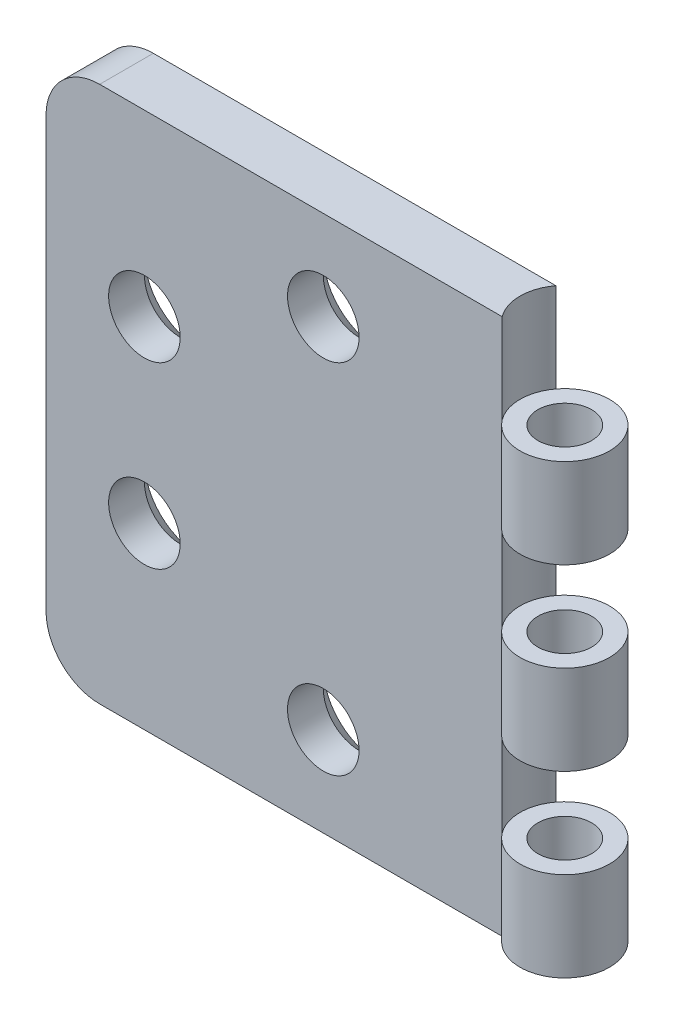
ISO-10303-21;
HEADER;
FILE_DESCRIPTION(('STEP AP214'),'2;1');
FILE_NAME('part.step','',(''),(''),'','','');
FILE_SCHEMA(('AUTOMOTIVE_DESIGN { 1 0 10303 214 1 1 1 1 }'));
ENDSEC;
DATA;
#1=APPLICATION_CONTEXT('core data for automotive mechanical design processes');
#2=APPLICATION_PROTOCOL_DEFINITION('international standard','automotive_design',2000,#1);
#3=PRODUCT_CONTEXT('',#1,'mechanical');
#4=PRODUCT('Part','Part','',(#3));
#5=PRODUCT_RELATED_PRODUCT_CATEGORY('part','',(#4));
#6=PRODUCT_DEFINITION_FORMATION('','',#4);
#7=PRODUCT_DEFINITION_CONTEXT('part definition',#1,'design');
#8=PRODUCT_DEFINITION('design','',#6,#7);
#9=PRODUCT_DEFINITION_SHAPE('','',#8);
#10=(LENGTH_UNIT() NAMED_UNIT(*) SI_UNIT(.MILLI.,.METRE.));
#11=(NAMED_UNIT(*) PLANE_ANGLE_UNIT() SI_UNIT($,.RADIAN.));
#12=(NAMED_UNIT(*) SI_UNIT($,.STERADIAN.) SOLID_ANGLE_UNIT());
#13=UNCERTAINTY_MEASURE_WITH_UNIT(LENGTH_MEASURE(1.E-05),#10,'distance_accuracy_value','');
#14=(GEOMETRIC_REPRESENTATION_CONTEXT(3) GLOBAL_UNCERTAINTY_ASSIGNED_CONTEXT((#13)) GLOBAL_UNIT_ASSIGNED_CONTEXT((#10,
#11,#12)) REPRESENTATION_CONTEXT('',''));
#15=CARTESIAN_POINT('',(0.,0.,0.));
#16=DIRECTION('',(0.,0.,1.));
#17=DIRECTION('',(1.,0.,0.));
#18=AXIS2_PLACEMENT_3D('',#15,#16,#17);
#19=CARTESIAN_POINT('',(12.5,15.,1.5));
#20=DIRECTION('',(0.,-1.,0.));
#21=DIRECTION('',(0.,0.,-1.));
#22=AXIS2_PLACEMENT_3D('',#19,#20,#21);
#23=CYLINDRICAL_SURFACE('',#22,2.5);
#24=DIRECTION('',(0.,-1.,0.));
#25=VECTOR('',#24,1.);
#26=CARTESIAN_POINT('',(10.5,22.0710678118655,0.));
#27=LINE('',#26,#25);
#28=CARTESIAN_POINT('',(10.5,10.,0.));
#29=VERTEX_POINT('',#28);
#30=CARTESIAN_POINT('',(10.5,5.,0.));
#31=VERTEX_POINT('',#30);
#32=EDGE_CURVE('E142',#29,#31,#27,.T.);
#33=ORIENTED_EDGE('',*,*,#32,.F.);
#34=CARTESIAN_POINT('',(12.5,10.,1.5));
#35=DIRECTION('',(0.,1.,0.));
#36=DIRECTION('',(0.,0.,1.));
#37=AXIS2_PLACEMENT_3D('',#34,#35,#36);
#38=CIRCLE('',#37,2.5);
#39=CARTESIAN_POINT('',(10.5,10.,3.));
#40=VERTEX_POINT('',#39);
#41=EDGE_CURVE('E153',#40,#29,#38,.T.);
#42=ORIENTED_EDGE('',*,*,#41,.F.);
#43=DIRECTION('',(0.,-1.,0.));
#44=VECTOR('',#43,1.);
#45=CARTESIAN_POINT('',(10.5,22.0710678118655,3.));
#46=LINE('',#45,#44);
#47=CARTESIAN_POINT('',(10.5,5.,3.));
#48=VERTEX_POINT('',#47);
#49=EDGE_CURVE('E284',#40,#48,#46,.T.);
#50=ORIENTED_EDGE('',*,*,#49,.T.);
#51=CARTESIAN_POINT('',(12.5,5.,1.5));
#52=DIRECTION('',(0.,-1.,0.));
#53=DIRECTION('',(0.,0.,-1.));
#54=AXIS2_PLACEMENT_3D('',#51,#52,#53);
#55=CIRCLE('',#54,2.5);
#56=EDGE_CURVE('E304',#31,#48,#55,.T.);
#57=ORIENTED_EDGE('',*,*,#56,.F.);
#58=EDGE_LOOP('',(#33,#42,#50,#57));
#59=FACE_BOUND('',#58,.T.);
#60=ADVANCED_FACE('F52',(#59),#23,.T.);
#61=CARTESIAN_POINT('',(12.5,0.,1.5));
#62=DIRECTION('',(0.,-1.,0.));
#63=DIRECTION('',(0.,0.,-1.));
#64=AXIS2_PLACEMENT_3D('',#61,#62,#63);
#65=CIRCLE('',#64,2.5);
#66=CARTESIAN_POINT('',(10.5,0.,0.));
#67=VERTEX_POINT('',#66);
#68=CARTESIAN_POINT('',(10.5,0.,3.));
#69=VERTEX_POINT('',#68);
#70=EDGE_CURVE('E293',#67,#69,#65,.T.);
#71=ORIENTED_EDGE('',*,*,#70,.T.);
#72=CARTESIAN_POINT('',(10.5,-5.,3.));
#73=VERTEX_POINT('',#72);
#74=EDGE_CURVE('E280',#69,#73,#46,.T.);
#75=ORIENTED_EDGE('',*,*,#74,.T.);
#76=CARTESIAN_POINT('',(12.5,-5.,1.5));
#77=DIRECTION('',(0.,-1.,0.));
#78=DIRECTION('',(0.,0.,-1.));
#79=AXIS2_PLACEMENT_3D('',#76,#77,#78);
#80=CIRCLE('',#79,2.5);
#81=CARTESIAN_POINT('',(10.5,-5.,0.));
#82=VERTEX_POINT('',#81);
#83=EDGE_CURVE('E192',#73,#82,#80,.F.);
#84=ORIENTED_EDGE('',*,*,#83,.T.);
#85=EDGE_CURVE('E401',#67,#82,#27,.T.);
#86=ORIENTED_EDGE('',*,*,#85,.F.);
#87=EDGE_LOOP('',(#71,#75,#84,#86));
#88=FACE_BOUND('',#87,.T.);
#89=ADVANCED_FACE('F237',(#88),#23,.T.);
#90=CARTESIAN_POINT('',(-15.,15.,3.));
#91=DIRECTION('',(0.,-1.,0.));
#92=DIRECTION('',(0.,0.,-1.));
#93=AXIS2_PLACEMENT_3D('',#90,#91,#92);
#94=PLANE('',#93);
#95=DIRECTION('',(-1.,0.,0.));
#96=VECTOR('',#95,1.);
#97=CARTESIAN_POINT('',(-15.,15.,3.));
#98=LINE('',#97,#96);
#99=CARTESIAN_POINT('',(10.5,15.,3.));
#100=VERTEX_POINT('',#99);
#101=CARTESIAN_POINT('',(-12.,15.,3.));
#102=VERTEX_POINT('',#101);
#103=EDGE_CURVE('E151',#100,#102,#98,.T.);
#104=ORIENTED_EDGE('',*,*,#103,.F.);
#105=CARTESIAN_POINT('',(12.5,15.,1.5));
#106=DIRECTION('',(0.,1.,0.));
#107=DIRECTION('',(0.,0.,1.));
#108=AXIS2_PLACEMENT_3D('',#105,#106,#107);
#109=CIRCLE('',#108,2.5);
#110=CARTESIAN_POINT('',(10.5,15.,0.));
#111=VERTEX_POINT('',#110);
#112=EDGE_CURVE('E137',#111,#100,#109,.T.);
#113=ORIENTED_EDGE('',*,*,#112,.F.);
#114=DIRECTION('',(-1.,0.,0.));
#115=VECTOR('',#114,1.);
#116=CARTESIAN_POINT('',(-15.,15.,0.));
#117=LINE('',#116,#115);
#118=CARTESIAN_POINT('',(-12.,15.,0.));
#119=VERTEX_POINT('',#118);
#120=EDGE_CURVE('E148',#111,#119,#117,.T.);
#121=ORIENTED_EDGE('',*,*,#120,.T.);
#122=DIRECTION('',(0.,0.,-1.));
#123=VECTOR('',#122,1.);
#124=CARTESIAN_POINT('',(-12.,15.,3.));
#125=LINE('',#124,#123);
#126=EDGE_CURVE('E181',#119,#102,#125,.F.);
#127=ORIENTED_EDGE('',*,*,#126,.T.);
#128=EDGE_LOOP('',(#104,#113,#121,#127));
#129=FACE_BOUND('',#128,.T.);
#130=ADVANCED_FACE('F147',(#129),#94,.F.);
#131=CARTESIAN_POINT('',(-15.,-15.,3.));
#132=DIRECTION('',(0.,1.,0.));
#133=DIRECTION('',(0.,0.,1.));
#134=AXIS2_PLACEMENT_3D('',#131,#132,#133);
#135=PLANE('',#134);
#136=CARTESIAN_POINT('',(12.5,-15.,1.5));
#137=DIRECTION('',(0.,-1.,0.));
#138=DIRECTION('',(0.,0.,-1.));
#139=AXIS2_PLACEMENT_3D('',#136,#137,#138);
#140=CIRCLE('',#139,1.5);
#141=CARTESIAN_POINT('',(12.5,-15.,0.));
#142=VERTEX_POINT('',#141);
#143=EDGE_CURVE('E200',#142,#142,#140,.T.);
#144=ORIENTED_EDGE('',*,*,#143,.F.);
#145=EDGE_LOOP('',(#144));
#146=FACE_BOUND('',#145,.T.);
#147=DIRECTION('',(1.,0.,0.));
#148=VECTOR('',#147,1.);
#149=CARTESIAN_POINT('',(-15.,-15.,3.));
#150=LINE('',#149,#148);
#151=CARTESIAN_POINT('',(-12.,-15.,3.));
#152=VERTEX_POINT('',#151);
#153=CARTESIAN_POINT('',(10.5,-15.,3.));
#154=VERTEX_POINT('',#153);
#155=EDGE_CURVE('E169',#152,#154,#150,.T.);
#156=ORIENTED_EDGE('',*,*,#155,.F.);
#157=DIRECTION('',(0.,0.,-1.));
#158=VECTOR('',#157,1.);
#159=CARTESIAN_POINT('',(-12.,-15.,3.));
#160=LINE('',#159,#158);
#161=CARTESIAN_POINT('',(-12.,-15.,0.));
#162=VERTEX_POINT('',#161);
#163=EDGE_CURVE('E187',#152,#162,#160,.T.);
#164=ORIENTED_EDGE('',*,*,#163,.T.);
#165=DIRECTION('',(1.,0.,0.));
#166=VECTOR('',#165,1.);
#167=CARTESIAN_POINT('',(-15.,-15.,0.));
#168=LINE('',#167,#166);
#169=CARTESIAN_POINT('',(10.5,-15.,0.));
#170=VERTEX_POINT('',#169);
#171=EDGE_CURVE('E163',#162,#170,#168,.T.);
#172=ORIENTED_EDGE('',*,*,#171,.T.);
#173=CARTESIAN_POINT('',(12.5,-15.,1.5));
#174=DIRECTION('',(0.,-1.,0.));
#175=DIRECTION('',(0.,0.,-1.));
#176=AXIS2_PLACEMENT_3D('',#173,#174,#175);
#177=CIRCLE('',#176,2.5);
#178=EDGE_CURVE('E160',#170,#154,#177,.T.);
#179=ORIENTED_EDGE('',*,*,#178,.T.);
#180=EDGE_LOOP('',(#156,#164,#172,#179));
#181=FACE_BOUND('',#180,.T.);
#182=ADVANCED_FACE('F417',(#146,#181),#135,.F.);
#183=CARTESIAN_POINT('',(0.,0.,3.));
#184=DIRECTION('',(0.,0.,1.));
#185=DIRECTION('',(1.,0.,0.));
#186=AXIS2_PLACEMENT_3D('',#183,#184,#185);
#187=PLANE('',#186);
#188=CARTESIAN_POINT('',(0.499999999999997,10.,3.));
#189=DIRECTION('',(0.,0.,1.));
#190=DIRECTION('',(1.,0.,0.));
#191=AXIS2_PLACEMENT_3D('',#188,#189,#190);
#192=CIRCLE('',#191,2.);
#193=CARTESIAN_POINT('',(2.5,10.,3.));
#194=VERTEX_POINT('',#193);
#195=EDGE_CURVE('E309',#194,#194,#192,.T.);
#196=ORIENTED_EDGE('',*,*,#195,.F.);
#197=EDGE_LOOP('',(#196));
#198=FACE_BOUND('',#197,.T.);
#199=CARTESIAN_POINT('',(-9.50000000000001,5.,3.));
#200=DIRECTION('',(0.,0.,1.));
#201=DIRECTION('',(1.,0.,0.));
#202=AXIS2_PLACEMENT_3D('',#199,#200,#201);
#203=CIRCLE('',#202,2.);
#204=CARTESIAN_POINT('',(-7.50000000000001,5.,3.));
#205=VERTEX_POINT('',#204);
#206=EDGE_CURVE('E313',#205,#205,#203,.T.);
#207=ORIENTED_EDGE('',*,*,#206,.F.);
#208=EDGE_LOOP('',(#207));
#209=FACE_BOUND('',#208,.T.);
#210=CARTESIAN_POINT('',(0.5,-10.,3.));
#211=DIRECTION('',(0.,0.,1.));
#212=DIRECTION('',(1.,0.,0.));
#213=AXIS2_PLACEMENT_3D('',#210,#211,#212);
#214=CIRCLE('',#213,2.);
#215=CARTESIAN_POINT('',(2.5,-10.,3.));
#216=VERTEX_POINT('',#215);
#217=EDGE_CURVE('E282',#216,#216,#214,.F.);
#218=ORIENTED_EDGE('',*,*,#217,.T.);
#219=EDGE_LOOP('',(#218));
#220=FACE_BOUND('',#219,.T.);
#221=CARTESIAN_POINT('',(-9.5,-5.,3.));
#222=DIRECTION('',(0.,0.,1.));
#223=DIRECTION('',(1.,0.,0.));
#224=AXIS2_PLACEMENT_3D('',#221,#222,#223);
#225=CIRCLE('',#224,2.);
#226=CARTESIAN_POINT('',(-7.5,-5.,3.));
#227=VERTEX_POINT('',#226);
#228=EDGE_CURVE('E278',#227,#227,#225,.F.);
#229=ORIENTED_EDGE('',*,*,#228,.T.);
#230=EDGE_LOOP('',(#229));
#231=FACE_BOUND('',#230,.T.);
#232=ORIENTED_EDGE('',*,*,#103,.T.);
#233=CARTESIAN_POINT('',(-12.,12.,3.));
#234=DIRECTION('',(0.,0.,1.));
#235=DIRECTION('',(1.,0.,0.));
#236=AXIS2_PLACEMENT_3D('',#233,#234,#235);
#237=CIRCLE('',#236,3.);
#238=CARTESIAN_POINT('',(-15.,12.,3.));
#239=VERTEX_POINT('',#238);
#240=EDGE_CURVE('E185',#102,#239,#237,.T.);
#241=ORIENTED_EDGE('',*,*,#240,.T.);
#242=DIRECTION('',(0.,-1.,0.));
#243=VECTOR('',#242,1.);
#244=CARTESIAN_POINT('',(-15.,15.,3.));
#245=LINE('',#244,#243);
#246=CARTESIAN_POINT('',(-15.,-12.,3.));
#247=VERTEX_POINT('',#246);
#248=EDGE_CURVE('E406',#239,#247,#245,.T.);
#249=ORIENTED_EDGE('',*,*,#248,.T.);
#250=CARTESIAN_POINT('',(-12.,-12.,3.));
#251=DIRECTION('',(0.,0.,1.));
#252=DIRECTION('',(1.,0.,0.));
#253=AXIS2_PLACEMENT_3D('',#250,#251,#252);
#254=CIRCLE('',#253,3.);
#255=EDGE_CURVE('E183',#247,#152,#254,.T.);
#256=ORIENTED_EDGE('',*,*,#255,.T.);
#257=ORIENTED_EDGE('',*,*,#155,.T.);
#258=CARTESIAN_POINT('',(10.5,-9.99999999999999,3.));
#259=VERTEX_POINT('',#258);
#260=EDGE_CURVE('E265',#259,#154,#46,.T.);
#261=ORIENTED_EDGE('',*,*,#260,.F.);
#262=EDGE_CURVE('E276',#73,#259,#46,.T.);
#263=ORIENTED_EDGE('',*,*,#262,.F.);
#264=ORIENTED_EDGE('',*,*,#74,.F.);
#265=DIRECTION('',(0.,-1.,0.));
#266=VECTOR('',#265,1.);
#267=CARTESIAN_POINT('',(10.5,5.,3.));
#268=LINE('',#267,#266);
#269=EDGE_CURVE('E296',#48,#69,#268,.T.);
#270=ORIENTED_EDGE('',*,*,#269,.F.);
#271=ORIENTED_EDGE('',*,*,#49,.F.);
#272=EDGE_CURVE('E166',#100,#40,#46,.T.);
#273=ORIENTED_EDGE('',*,*,#272,.F.);
#274=EDGE_LOOP('',(#232,#241,#249,#256,#257,#261,#263,#264,#270,#271,#273));
#275=FACE_BOUND('',#274,.T.);
#276=ADVANCED_FACE('F273',(#198,#209,#220,#231,#275),#187,.T.);
#277=CARTESIAN_POINT('',(0.,0.,0.));
#278=DIRECTION('',(0.,0.,1.));
#279=DIRECTION('',(1.,0.,0.));
#280=AXIS2_PLACEMENT_3D('',#277,#278,#279);
#281=PLANE('',#280);
#282=CARTESIAN_POINT('',(0.499999999999997,10.,0.));
#283=DIRECTION('',(0.,0.,1.));
#284=DIRECTION('',(1.,0.,0.));
#285=AXIS2_PLACEMENT_3D('',#282,#283,#284);
#286=CIRCLE('',#285,2.99999999999999);
#287=CARTESIAN_POINT('',(3.49999999999999,10.,0.));
#288=VERTEX_POINT('',#287);
#289=EDGE_CURVE('E209',#288,#288,#286,.T.);
#290=ORIENTED_EDGE('',*,*,#289,.T.);
#291=EDGE_LOOP('',(#290));
#292=FACE_BOUND('',#291,.T.);
#293=CARTESIAN_POINT('',(-9.50000000000001,5.,0.));
#294=DIRECTION('',(0.,0.,1.));
#295=DIRECTION('',(1.,0.,0.));
#296=AXIS2_PLACEMENT_3D('',#293,#294,#295);
#297=CIRCLE('',#296,2.99999999999999);
#298=CARTESIAN_POINT('',(-6.50000000000001,5.,0.));
#299=VERTEX_POINT('',#298);
#300=EDGE_CURVE('E206',#299,#299,#297,.T.);
#301=ORIENTED_EDGE('',*,*,#300,.T.);
#302=EDGE_LOOP('',(#301));
#303=FACE_BOUND('',#302,.T.);
#304=CARTESIAN_POINT('',(-9.5,-5.,0.));
#305=DIRECTION('',(0.,0.,1.));
#306=DIRECTION('',(1.,0.,0.));
#307=AXIS2_PLACEMENT_3D('',#304,#305,#306);
#308=CIRCLE('',#307,3.00000000000001);
#309=CARTESIAN_POINT('',(-6.49999999999999,-5.,0.));
#310=VERTEX_POINT('',#309);
#311=EDGE_CURVE('E203',#310,#310,#308,.T.);
#312=ORIENTED_EDGE('',*,*,#311,.T.);
#313=EDGE_LOOP('',(#312));
#314=FACE_BOUND('',#313,.T.);
#315=CARTESIAN_POINT('',(0.5,-10.,0.));
#316=DIRECTION('',(0.,0.,1.));
#317=DIRECTION('',(1.,0.,0.));
#318=AXIS2_PLACEMENT_3D('',#315,#316,#317);
#319=CIRCLE('',#318,3.00000000000001);
#320=CARTESIAN_POINT('',(3.50000000000001,-10.,0.));
#321=VERTEX_POINT('',#320);
#322=EDGE_CURVE('E195',#321,#321,#319,.T.);
#323=ORIENTED_EDGE('',*,*,#322,.T.);
#324=EDGE_LOOP('',(#323));
#325=FACE_BOUND('',#324,.T.);
#326=DIRECTION('',(0.,-1.,0.));
#327=VECTOR('',#326,1.);
#328=CARTESIAN_POINT('',(-15.,15.,0.));
#329=LINE('',#328,#327);
#330=CARTESIAN_POINT('',(-15.,12.,0.));
#331=VERTEX_POINT('',#330);
#332=CARTESIAN_POINT('',(-15.,-12.,0.));
#333=VERTEX_POINT('',#332);
#334=EDGE_CURVE('E159',#331,#333,#329,.T.);
#335=ORIENTED_EDGE('',*,*,#334,.F.);
#336=CARTESIAN_POINT('',(-12.,12.,0.));
#337=DIRECTION('',(0.,0.,1.));
#338=DIRECTION('',(1.,0.,0.));
#339=AXIS2_PLACEMENT_3D('',#336,#337,#338);
#340=CIRCLE('',#339,3.);
#341=EDGE_CURVE('E158',#331,#119,#340,.F.);
#342=ORIENTED_EDGE('',*,*,#341,.T.);
#343=ORIENTED_EDGE('',*,*,#120,.F.);
#344=EDGE_CURVE('E134',#111,#29,#27,.T.);
#345=ORIENTED_EDGE('',*,*,#344,.T.);
#346=ORIENTED_EDGE('',*,*,#32,.T.);
#347=EDGE_CURVE('E404',#31,#67,#27,.T.);
#348=ORIENTED_EDGE('',*,*,#347,.T.);
#349=ORIENTED_EDGE('',*,*,#85,.T.);
#350=CARTESIAN_POINT('',(10.5,-10.,0.));
#351=VERTEX_POINT('',#350);
#352=EDGE_CURVE('E144',#82,#351,#27,.T.);
#353=ORIENTED_EDGE('',*,*,#352,.T.);
#354=EDGE_CURVE('E267',#351,#170,#27,.T.);
#355=ORIENTED_EDGE('',*,*,#354,.T.);
#356=ORIENTED_EDGE('',*,*,#171,.F.);
#357=CARTESIAN_POINT('',(-12.,-12.,0.));
#358=DIRECTION('',(0.,0.,1.));
#359=DIRECTION('',(1.,0.,0.));
#360=AXIS2_PLACEMENT_3D('',#357,#358,#359);
#361=CIRCLE('',#360,3.);
#362=EDGE_CURVE('E178',#162,#333,#361,.F.);
#363=ORIENTED_EDGE('',*,*,#362,.T.);
#364=EDGE_LOOP('',(#335,#342,#343,#345,#346,#348,#349,#353,#355,#356,#363));
#365=FACE_BOUND('',#364,.T.);
#366=ADVANCED_FACE('F157',(#292,#303,#314,#325,#365),#281,.F.);
#367=CARTESIAN_POINT('',(-15.,15.,3.));
#368=DIRECTION('',(1.,0.,0.));
#369=DIRECTION('',(0.,1.,0.));
#370=AXIS2_PLACEMENT_3D('',#367,#368,#369);
#371=PLANE('',#370);
#372=ORIENTED_EDGE('',*,*,#248,.F.);
#373=DIRECTION('',(0.,0.,-1.));
#374=VECTOR('',#373,1.);
#375=CARTESIAN_POINT('',(-15.,12.,3.));
#376=LINE('',#375,#374);
#377=EDGE_CURVE('E175',#239,#331,#376,.T.);
#378=ORIENTED_EDGE('',*,*,#377,.T.);
#379=ORIENTED_EDGE('',*,*,#334,.T.);
#380=DIRECTION('',(0.,0.,-1.));
#381=VECTOR('',#380,1.);
#382=CARTESIAN_POINT('',(-15.,-12.,3.));
#383=LINE('',#382,#381);
#384=EDGE_CURVE('E141',#333,#247,#383,.F.);
#385=ORIENTED_EDGE('',*,*,#384,.T.);
#386=EDGE_LOOP('',(#372,#378,#379,#385));
#387=FACE_BOUND('',#386,.T.);
#388=ADVANCED_FACE('F250',(#387),#371,.F.);
#389=CARTESIAN_POINT('',(12.5,-10.,1.5));
#390=DIRECTION('',(0.,-1.,0.));
#391=DIRECTION('',(0.,0.,-1.));
#392=AXIS2_PLACEMENT_3D('',#389,#390,#391);
#393=CIRCLE('',#392,2.5);
#394=EDGE_CURVE('E190',#259,#351,#393,.F.);
#395=ORIENTED_EDGE('',*,*,#394,.F.);
#396=ORIENTED_EDGE('',*,*,#260,.T.);
#397=ORIENTED_EDGE('',*,*,#178,.F.);
#398=ORIENTED_EDGE('',*,*,#354,.F.);
#399=EDGE_LOOP('',(#395,#396,#397,#398));
#400=FACE_BOUND('',#399,.T.);
#401=ADVANCED_FACE('F240',(#400),#23,.T.);
#402=CARTESIAN_POINT('',(-12.,12.,3.));
#403=DIRECTION('',(0.,0.,-1.));
#404=DIRECTION('',(-1.,0.,0.));
#405=AXIS2_PLACEMENT_3D('',#402,#403,#404);
#406=CYLINDRICAL_SURFACE('',#405,3.);
#407=ORIENTED_EDGE('',*,*,#240,.F.);
#408=ORIENTED_EDGE('',*,*,#126,.F.);
#409=ORIENTED_EDGE('',*,*,#341,.F.);
#410=ORIENTED_EDGE('',*,*,#377,.F.);
#411=EDGE_LOOP('',(#407,#408,#409,#410));
#412=FACE_BOUND('',#411,.T.);
#413=ADVANCED_FACE('F249',(#412),#406,.T.);
#414=CARTESIAN_POINT('',(-12.,-12.,3.));
#415=DIRECTION('',(0.,0.,-1.));
#416=DIRECTION('',(-1.,0.,0.));
#417=AXIS2_PLACEMENT_3D('',#414,#415,#416);
#418=CYLINDRICAL_SURFACE('',#417,3.);
#419=ORIENTED_EDGE('',*,*,#255,.F.);
#420=ORIENTED_EDGE('',*,*,#384,.F.);
#421=ORIENTED_EDGE('',*,*,#362,.F.);
#422=ORIENTED_EDGE('',*,*,#163,.F.);
#423=EDGE_LOOP('',(#419,#420,#421,#422));
#424=FACE_BOUND('',#423,.T.);
#425=ADVANCED_FACE('F256',(#424),#418,.T.);
#426=CARTESIAN_POINT('',(-9.5,-5.,-1.));
#427=DIRECTION('',(0.,0.,1.));
#428=DIRECTION('',(1.,0.,0.));
#429=AXIS2_PLACEMENT_3D('',#426,#427,#428);
#430=CYLINDRICAL_SURFACE('',#429,2.);
#431=CARTESIAN_POINT('',(-9.5,-5.,1.));
#432=DIRECTION('',(0.,0.,1.));
#433=DIRECTION('',(1.,0.,0.));
#434=AXIS2_PLACEMENT_3D('',#431,#432,#433);
#435=CIRCLE('',#434,2.);
#436=CARTESIAN_POINT('',(-7.5,-5.,1.));
#437=VERTEX_POINT('',#436);
#438=EDGE_CURVE('E60',#437,#437,#435,.F.);
#439=ORIENTED_EDGE('',*,*,#438,.T.);
#440=EDGE_LOOP('',(#439));
#441=FACE_BOUND('',#440,.T.);
#442=ORIENTED_EDGE('',*,*,#228,.F.);
#443=EDGE_LOOP('',(#442));
#444=FACE_BOUND('',#443,.T.);
#445=ADVANCED_FACE('F220',(#441,#444),#430,.F.);
#446=CARTESIAN_POINT('',(0.5,-10.,-1.));
#447=DIRECTION('',(0.,0.,1.));
#448=DIRECTION('',(1.,0.,0.));
#449=AXIS2_PLACEMENT_3D('',#446,#447,#448);
#450=CYLINDRICAL_SURFACE('',#449,2.);
#451=CARTESIAN_POINT('',(0.5,-10.,1.));
#452=DIRECTION('',(0.,0.,1.));
#453=DIRECTION('',(1.,0.,0.));
#454=AXIS2_PLACEMENT_3D('',#451,#452,#453);
#455=CIRCLE('',#454,2.);
#456=CARTESIAN_POINT('',(2.5,-10.,1.));
#457=VERTEX_POINT('',#456);
#458=EDGE_CURVE('E12',#457,#457,#455,.F.);
#459=ORIENTED_EDGE('',*,*,#458,.T.);
#460=EDGE_LOOP('',(#459));
#461=FACE_BOUND('',#460,.T.);
#462=ORIENTED_EDGE('',*,*,#217,.F.);
#463=EDGE_LOOP('',(#462));
#464=FACE_BOUND('',#463,.T.);
#465=ADVANCED_FACE('F321',(#461,#464),#450,.F.);
#466=CARTESIAN_POINT('',(-9.50000000000001,5.,-1.));
#467=DIRECTION('',(0.,0.,1.));
#468=DIRECTION('',(1.,0.,0.));
#469=AXIS2_PLACEMENT_3D('',#466,#467,#468);
#470=CYLINDRICAL_SURFACE('',#469,2.);
#471=CARTESIAN_POINT('',(-9.50000000000001,5.,0.999999999999995));
#472=DIRECTION('',(0.,0.,1.));
#473=DIRECTION('',(1.,0.,0.));
#474=AXIS2_PLACEMENT_3D('',#471,#472,#473);
#475=CIRCLE('',#474,2.);
#476=CARTESIAN_POINT('',(-7.50000000000001,5.,0.999999999999995));
#477=VERTEX_POINT('',#476);
#478=EDGE_CURVE('E215',#477,#477,#475,.F.);
#479=ORIENTED_EDGE('',*,*,#478,.T.);
#480=EDGE_LOOP('',(#479));
#481=FACE_BOUND('',#480,.T.);
#482=ORIENTED_EDGE('',*,*,#206,.T.);
#483=EDGE_LOOP('',(#482));
#484=FACE_BOUND('',#483,.T.);
#485=ADVANCED_FACE('F323',(#481,#484),#470,.F.);
#486=CARTESIAN_POINT('',(0.499999999999997,10.,-1.));
#487=DIRECTION('',(0.,0.,1.));
#488=DIRECTION('',(1.,0.,0.));
#489=AXIS2_PLACEMENT_3D('',#486,#487,#488);
#490=CYLINDRICAL_SURFACE('',#489,2.);
#491=CARTESIAN_POINT('',(0.499999999999997,10.,0.999999999999995));
#492=DIRECTION('',(0.,0.,1.));
#493=DIRECTION('',(1.,0.,0.));
#494=AXIS2_PLACEMENT_3D('',#491,#492,#493);
#495=CIRCLE('',#494,2.);
#496=CARTESIAN_POINT('',(2.5,10.,0.999999999999995));
#497=VERTEX_POINT('',#496);
#498=EDGE_CURVE('E212',#497,#497,#495,.F.);
#499=ORIENTED_EDGE('',*,*,#498,.T.);
#500=EDGE_LOOP('',(#499));
#501=FACE_BOUND('',#500,.T.);
#502=ORIENTED_EDGE('',*,*,#195,.T.);
#503=EDGE_LOOP('',(#502));
#504=FACE_BOUND('',#503,.T.);
#505=ADVANCED_FACE('F330',(#501,#504),#490,.F.);
#506=CARTESIAN_POINT('',(12.5,-5.,1.5));
#507=DIRECTION('',(0.,-1.,0.));
#508=DIRECTION('',(0.,0.,-1.));
#509=AXIS2_PLACEMENT_3D('',#506,#507,#508);
#510=CYLINDRICAL_SURFACE('',#509,2.5);
#511=ORIENTED_EDGE('',*,*,#262,.T.);
#512=CARTESIAN_POINT('',(12.5,-10.,1.5));
#513=DIRECTION('',(0.,-1.,0.));
#514=DIRECTION('',(0.,0.,-1.));
#515=AXIS2_PLACEMENT_3D('',#512,#513,#514);
#516=CIRCLE('',#515,2.5);
#517=EDGE_CURVE('E298',#259,#351,#516,.T.);
#518=ORIENTED_EDGE('',*,*,#517,.T.);
#519=ORIENTED_EDGE('',*,*,#352,.F.);
#520=CARTESIAN_POINT('',(12.5,-5.,1.5));
#521=DIRECTION('',(0.,-1.,0.));
#522=DIRECTION('',(0.,0.,-1.));
#523=AXIS2_PLACEMENT_3D('',#520,#521,#522);
#524=CIRCLE('',#523,2.5);
#525=EDGE_CURVE('E301',#73,#82,#524,.T.);
#526=ORIENTED_EDGE('',*,*,#525,.F.);
#527=EDGE_LOOP('',(#511,#518,#519,#526));
#528=FACE_BOUND('',#527,.T.);
#529=ADVANCED_FACE('F336',(#528),#510,.F.);
#530=CARTESIAN_POINT('',(12.5,-5.,1.5));
#531=DIRECTION('',(0.,-1.,0.));
#532=DIRECTION('',(0.,0.,-1.));
#533=AXIS2_PLACEMENT_3D('',#530,#531,#532);
#534=PLANE('',#533);
#535=CARTESIAN_POINT('',(12.5,-5.,1.5));
#536=DIRECTION('',(0.,-1.,0.));
#537=DIRECTION('',(0.,0.,-1.));
#538=AXIS2_PLACEMENT_3D('',#535,#536,#537);
#539=CIRCLE('',#538,1.5);
#540=CARTESIAN_POINT('',(12.5,-5.,0.));
#541=VERTEX_POINT('',#540);
#542=EDGE_CURVE('E154',#541,#541,#539,.T.);
#543=ORIENTED_EDGE('',*,*,#542,.F.);
#544=EDGE_LOOP('',(#543));
#545=FACE_BOUND('',#544,.T.);
#546=ORIENTED_EDGE('',*,*,#525,.T.);
#547=ORIENTED_EDGE('',*,*,#83,.F.);
#548=EDGE_LOOP('',(#546,#547));
#549=FACE_BOUND('',#548,.T.);
#550=ADVANCED_FACE('F340',(#545,#549),#534,.T.);
#551=CARTESIAN_POINT('',(12.5,-10.,1.5));
#552=DIRECTION('',(0.,-1.,0.));
#553=DIRECTION('',(0.,0.,-1.));
#554=AXIS2_PLACEMENT_3D('',#551,#552,#553);
#555=PLANE('',#554);
#556=CARTESIAN_POINT('',(12.5,-10.,1.5));
#557=DIRECTION('',(0.,-1.,0.));
#558=DIRECTION('',(0.,0.,-1.));
#559=AXIS2_PLACEMENT_3D('',#556,#557,#558);
#560=CIRCLE('',#559,1.5);
#561=CARTESIAN_POINT('',(12.5,-10.,0.));
#562=VERTEX_POINT('',#561);
#563=EDGE_CURVE('E388',#562,#562,#560,.T.);
#564=ORIENTED_EDGE('',*,*,#563,.T.);
#565=EDGE_LOOP('',(#564));
#566=FACE_BOUND('',#565,.T.);
#567=ORIENTED_EDGE('',*,*,#517,.F.);
#568=ORIENTED_EDGE('',*,*,#394,.T.);
#569=EDGE_LOOP('',(#567,#568));
#570=FACE_BOUND('',#569,.T.);
#571=ADVANCED_FACE('F342',(#566,#570),#555,.F.);
#572=CARTESIAN_POINT('',(12.5,5.,1.5));
#573=DIRECTION('',(0.,-1.,0.));
#574=DIRECTION('',(0.,0.,-1.));
#575=AXIS2_PLACEMENT_3D('',#572,#573,#574);
#576=CYLINDRICAL_SURFACE('',#575,2.5);
#577=ORIENTED_EDGE('',*,*,#269,.T.);
#578=EDGE_CURVE('E75',#69,#67,#65,.T.);
#579=ORIENTED_EDGE('',*,*,#578,.T.);
#580=ORIENTED_EDGE('',*,*,#347,.F.);
#581=EDGE_CURVE('E299',#48,#31,#55,.T.);
#582=ORIENTED_EDGE('',*,*,#581,.F.);
#583=EDGE_LOOP('',(#577,#579,#580,#582));
#584=FACE_BOUND('',#583,.T.);
#585=ADVANCED_FACE('F345',(#584),#576,.F.);
#586=CARTESIAN_POINT('',(12.5,5.,1.5));
#587=DIRECTION('',(0.,-1.,0.));
#588=DIRECTION('',(0.,0.,-1.));
#589=AXIS2_PLACEMENT_3D('',#586,#587,#588);
#590=PLANE('',#589);
#591=CARTESIAN_POINT('',(12.5,5.,1.5));
#592=DIRECTION('',(0.,-1.,0.));
#593=DIRECTION('',(0.,0.,-1.));
#594=AXIS2_PLACEMENT_3D('',#591,#592,#593);
#595=CIRCLE('',#594,1.5);
#596=CARTESIAN_POINT('',(12.5,5.,0.));
#597=VERTEX_POINT('',#596);
#598=EDGE_CURVE('E389',#597,#597,#595,.T.);
#599=ORIENTED_EDGE('',*,*,#598,.F.);
#600=EDGE_LOOP('',(#599));
#601=FACE_BOUND('',#600,.T.);
#602=ORIENTED_EDGE('',*,*,#581,.T.);
#603=ORIENTED_EDGE('',*,*,#56,.T.);
#604=EDGE_LOOP('',(#602,#603));
#605=FACE_BOUND('',#604,.T.);
#606=ADVANCED_FACE('F352',(#601,#605),#590,.T.);
#607=CARTESIAN_POINT('',(12.5,0.,1.5));
#608=DIRECTION('',(0.,-1.,0.));
#609=DIRECTION('',(0.,0.,-1.));
#610=AXIS2_PLACEMENT_3D('',#607,#608,#609);
#611=PLANE('',#610);
#612=CARTESIAN_POINT('',(12.5,0.,1.5));
#613=DIRECTION('',(0.,-1.,0.));
#614=DIRECTION('',(0.,0.,-1.));
#615=AXIS2_PLACEMENT_3D('',#612,#613,#614);
#616=CIRCLE('',#615,1.5);
#617=CARTESIAN_POINT('',(12.5,0.,0.));
#618=VERTEX_POINT('',#617);
#619=EDGE_CURVE('E199',#618,#618,#616,.T.);
#620=ORIENTED_EDGE('',*,*,#619,.T.);
#621=EDGE_LOOP('',(#620));
#622=FACE_BOUND('',#621,.T.);
#623=ORIENTED_EDGE('',*,*,#578,.F.);
#624=ORIENTED_EDGE('',*,*,#70,.F.);
#625=EDGE_LOOP('',(#623,#624));
#626=FACE_BOUND('',#625,.T.);
#627=ADVANCED_FACE('F353',(#622,#626),#611,.F.);
#628=CARTESIAN_POINT('',(12.5,10.,1.5));
#629=DIRECTION('',(0.,1.,0.));
#630=DIRECTION('',(0.,0.,1.));
#631=AXIS2_PLACEMENT_3D('',#628,#629,#630);
#632=CYLINDRICAL_SURFACE('',#631,2.5);
#633=ORIENTED_EDGE('',*,*,#272,.T.);
#634=EDGE_CURVE('E67',#29,#40,#38,.T.);
#635=ORIENTED_EDGE('',*,*,#634,.F.);
#636=ORIENTED_EDGE('',*,*,#344,.F.);
#637=ORIENTED_EDGE('',*,*,#112,.T.);
#638=EDGE_LOOP('',(#633,#635,#636,#637));
#639=FACE_BOUND('',#638,.T.);
#640=ADVANCED_FACE('F136',(#639),#632,.F.);
#641=CARTESIAN_POINT('',(12.5,10.,1.5));
#642=DIRECTION('',(0.,1.,0.));
#643=DIRECTION('',(0.,0.,1.));
#644=AXIS2_PLACEMENT_3D('',#641,#642,#643);
#645=PLANE('',#644);
#646=CARTESIAN_POINT('',(12.5,10.,1.5));
#647=DIRECTION('',(0.,1.,0.));
#648=DIRECTION('',(0.,0.,1.));
#649=AXIS2_PLACEMENT_3D('',#646,#647,#648);
#650=CIRCLE('',#649,1.5);
#651=CARTESIAN_POINT('',(12.5,10.,3.));
#652=VERTEX_POINT('',#651);
#653=EDGE_CURVE('E196',#652,#652,#650,.T.);
#654=ORIENTED_EDGE('',*,*,#653,.F.);
#655=EDGE_LOOP('',(#654));
#656=FACE_BOUND('',#655,.T.);
#657=ORIENTED_EDGE('',*,*,#634,.T.);
#658=ORIENTED_EDGE('',*,*,#41,.T.);
#659=EDGE_LOOP('',(#657,#658));
#660=FACE_BOUND('',#659,.T.);
#661=ADVANCED_FACE('F292',(#656,#660),#645,.T.);
#662=CARTESIAN_POINT('',(12.5,15.,1.5));
#663=DIRECTION('',(0.,-1.,0.));
#664=DIRECTION('',(0.,0.,-1.));
#665=AXIS2_PLACEMENT_3D('',#662,#663,#664);
#666=CYLINDRICAL_SURFACE('',#665,1.5);
#667=ORIENTED_EDGE('',*,*,#598,.T.);
#668=EDGE_LOOP('',(#667));
#669=FACE_BOUND('',#668,.T.);
#670=ORIENTED_EDGE('',*,*,#653,.T.);
#671=EDGE_LOOP('',(#670));
#672=FACE_BOUND('',#671,.T.);
#673=ADVANCED_FACE('F364',(#669,#672),#666,.F.);
#674=ORIENTED_EDGE('',*,*,#542,.T.);
#675=EDGE_LOOP('',(#674));
#676=FACE_BOUND('',#675,.T.);
#677=ORIENTED_EDGE('',*,*,#619,.F.);
#678=EDGE_LOOP('',(#677));
#679=FACE_BOUND('',#678,.T.);
#680=ADVANCED_FACE('F367',(#676,#679),#666,.F.);
#681=ORIENTED_EDGE('',*,*,#143,.T.);
#682=EDGE_LOOP('',(#681));
#683=FACE_BOUND('',#682,.T.);
#684=ORIENTED_EDGE('',*,*,#563,.F.);
#685=EDGE_LOOP('',(#684));
#686=FACE_BOUND('',#685,.T.);
#687=ADVANCED_FACE('F369',(#683,#686),#666,.F.);
#688=CARTESIAN_POINT('',(0.499999999999997,10.,0.));
#689=DIRECTION('',(0.,0.,-1.));
#690=DIRECTION('',(-1.,0.,0.));
#691=AXIS2_PLACEMENT_3D('',#688,#689,#690);
#692=CONICAL_SURFACE('',#691,2.99999999999999,0.785398163397447);
#693=ORIENTED_EDGE('',*,*,#498,.F.);
#694=EDGE_LOOP('',(#693));
#695=FACE_BOUND('',#694,.T.);
#696=ORIENTED_EDGE('',*,*,#289,.F.);
#697=EDGE_LOOP('',(#696));
#698=FACE_BOUND('',#697,.T.);
#699=ADVANCED_FACE('F232',(#695,#698),#692,.F.);
#700=CARTESIAN_POINT('',(-9.50000000000001,5.,0.));
#701=DIRECTION('',(0.,0.,-1.));
#702=DIRECTION('',(-1.,0.,0.));
#703=AXIS2_PLACEMENT_3D('',#700,#701,#702);
#704=CONICAL_SURFACE('',#703,2.99999999999999,0.785398163397447);
#705=ORIENTED_EDGE('',*,*,#478,.F.);
#706=EDGE_LOOP('',(#705));
#707=FACE_BOUND('',#706,.T.);
#708=ORIENTED_EDGE('',*,*,#300,.F.);
#709=EDGE_LOOP('',(#708));
#710=FACE_BOUND('',#709,.T.);
#711=ADVANCED_FACE('F225',(#707,#710),#704,.F.);
#712=CARTESIAN_POINT('',(-9.5,-5.,1.));
#713=DIRECTION('',(0.,0.,-1.));
#714=DIRECTION('',(-1.,0.,0.));
#715=AXIS2_PLACEMENT_3D('',#712,#713,#714);
#716=CONICAL_SURFACE('',#715,2.,0.785398163397452);
#717=ORIENTED_EDGE('',*,*,#311,.F.);
#718=EDGE_LOOP('',(#717));
#719=FACE_BOUND('',#718,.T.);
#720=ORIENTED_EDGE('',*,*,#438,.F.);
#721=EDGE_LOOP('',(#720));
#722=FACE_BOUND('',#721,.T.);
#723=ADVANCED_FACE('F223',(#719,#722),#716,.F.);
#724=CARTESIAN_POINT('',(0.5,-10.,1.));
#725=DIRECTION('',(0.,0.,-1.));
#726=DIRECTION('',(-1.,0.,0.));
#727=AXIS2_PLACEMENT_3D('',#724,#725,#726);
#728=CONICAL_SURFACE('',#727,2.,0.785398163397452);
#729=ORIENTED_EDGE('',*,*,#322,.F.);
#730=EDGE_LOOP('',(#729));
#731=FACE_BOUND('',#730,.T.);
#732=ORIENTED_EDGE('',*,*,#458,.F.);
#733=EDGE_LOOP('',(#732));
#734=FACE_BOUND('',#733,.T.);
#735=ADVANCED_FACE('F54',(#731,#734),#728,.F.);
#736=CLOSED_SHELL('',(#60,#89,#130,#182,#276,#366,#388,#401,#413,#425,#445,#465,#485,#505,#529,
#550,#571,#585,#606,#627,#640,#661,#673,#680,#687,#699,#711,#723,#735));
#737=MANIFOLD_SOLID_BREP('B2',#736);
#738=ADVANCED_BREP_SHAPE_REPRESENTATION('',(#18,#737),#14);
#739=SHAPE_DEFINITION_REPRESENTATION(#9,#738);
ENDSEC;
END-ISO-10303-21;
